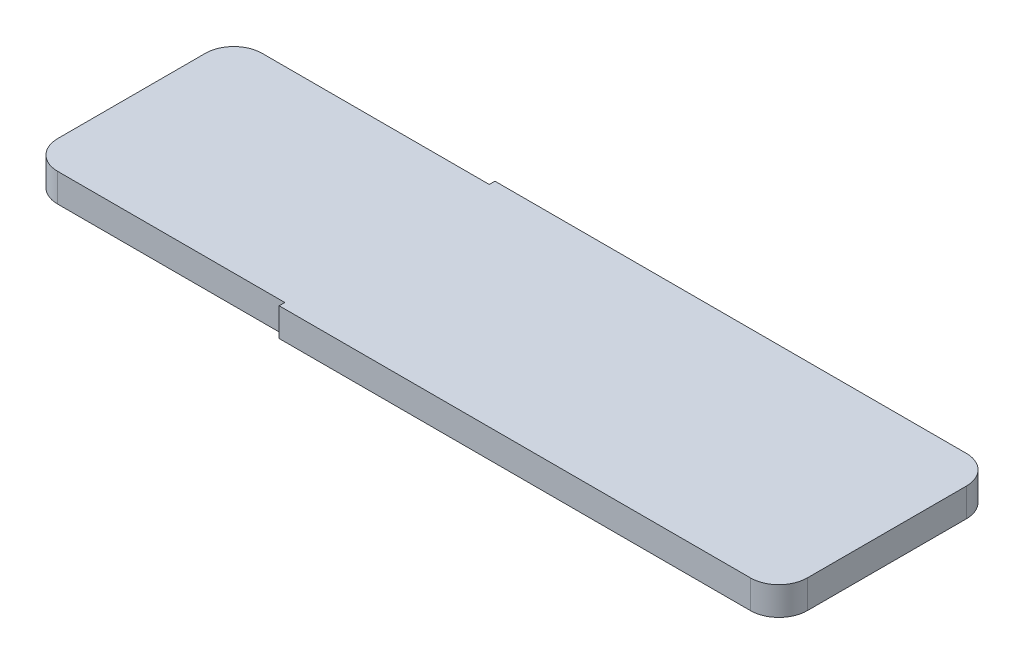
ISO-10303-21;
HEADER;
FILE_DESCRIPTION(('STEP AP214'),'2;1');
FILE_NAME('part.step','',(''),(''),'','','');
FILE_SCHEMA(('AUTOMOTIVE_DESIGN { 1 0 10303 214 1 1 1 1 }'));
ENDSEC;
DATA;
#1=APPLICATION_CONTEXT('core data for automotive mechanical design processes');
#2=APPLICATION_PROTOCOL_DEFINITION('international standard','automotive_design',2000,#1);
#3=PRODUCT_CONTEXT('',#1,'mechanical');
#4=PRODUCT('Part','Part','',(#3));
#5=PRODUCT_RELATED_PRODUCT_CATEGORY('part','',(#4));
#6=PRODUCT_DEFINITION_FORMATION('','',#4);
#7=PRODUCT_DEFINITION_CONTEXT('part definition',#1,'design');
#8=PRODUCT_DEFINITION('design','',#6,#7);
#9=PRODUCT_DEFINITION_SHAPE('','',#8);
#10=(LENGTH_UNIT() NAMED_UNIT(*) SI_UNIT(.MILLI.,.METRE.));
#11=(NAMED_UNIT(*) PLANE_ANGLE_UNIT() SI_UNIT($,.RADIAN.));
#12=(NAMED_UNIT(*) SI_UNIT($,.STERADIAN.) SOLID_ANGLE_UNIT());
#13=UNCERTAINTY_MEASURE_WITH_UNIT(LENGTH_MEASURE(1.E-05),#10,'distance_accuracy_value','');
#14=(GEOMETRIC_REPRESENTATION_CONTEXT(3) GLOBAL_UNCERTAINTY_ASSIGNED_CONTEXT((#13)) GLOBAL_UNIT_ASSIGNED_CONTEXT((#10,
#11,#12)) REPRESENTATION_CONTEXT('',''));
#15=CARTESIAN_POINT('',(0.,0.,0.));
#16=DIRECTION('',(0.,0.,1.));
#17=DIRECTION('',(1.,0.,0.));
#18=AXIS2_PLACEMENT_3D('',#15,#16,#17);
#19=CARTESIAN_POINT('',(-166.,5.,36.));
#20=DIRECTION('',(1.,0.,0.));
#21=DIRECTION('',(0.,0.,-1.));
#22=AXIS2_PLACEMENT_3D('',#19,#20,#21);
#23=PLANE('',#22);
#24=DIRECTION('',(0.,0.,1.));
#25=VECTOR('',#24,1.);
#26=CARTESIAN_POINT('',(-166.,-5.,36.));
#27=LINE('',#26,#25);
#28=CARTESIAN_POINT('',(-166.,-5.,-26.));
#29=VERTEX_POINT('',#28);
#30=CARTESIAN_POINT('',(-166.,-5.,26.));
#31=VERTEX_POINT('',#30);
#32=EDGE_CURVE('E169',#29,#31,#27,.T.);
#33=ORIENTED_EDGE('',*,*,#32,.T.);
#34=DIRECTION('',(0.,-1.,0.));
#35=VECTOR('',#34,1.);
#36=CARTESIAN_POINT('',(-166.,5.,26.));
#37=LINE('',#36,#35);
#38=CARTESIAN_POINT('',(-166.,5.,26.));
#39=VERTEX_POINT('',#38);
#40=EDGE_CURVE('E47',#31,#39,#37,.F.);
#41=ORIENTED_EDGE('',*,*,#40,.T.);
#42=DIRECTION('',(0.,0.,1.));
#43=VECTOR('',#42,1.);
#44=CARTESIAN_POINT('',(-166.,5.,36.));
#45=LINE('',#44,#43);
#46=CARTESIAN_POINT('',(-166.,5.,-26.));
#47=VERTEX_POINT('',#46);
#48=EDGE_CURVE('E140',#47,#39,#45,.T.);
#49=ORIENTED_EDGE('',*,*,#48,.F.);
#50=DIRECTION('',(0.,-1.,0.));
#51=VECTOR('',#50,1.);
#52=CARTESIAN_POINT('',(-166.,5.,-26.));
#53=LINE('',#52,#51);
#54=EDGE_CURVE('E218',#47,#29,#53,.T.);
#55=ORIENTED_EDGE('',*,*,#54,.T.);
#56=EDGE_LOOP('',(#33,#41,#49,#55));
#57=FACE_BOUND('',#56,.T.);
#58=ADVANCED_FACE('F39',(#57),#23,.F.);
#59=CARTESIAN_POINT('',(-76.,5.,36.));
#60=DIRECTION('',(0.,0.,-1.));
#61=DIRECTION('',(-1.,0.,0.));
#62=AXIS2_PLACEMENT_3D('',#59,#60,#61);
#63=PLANE('',#62);
#64=DIRECTION('',(1.,0.,0.));
#65=VECTOR('',#64,1.);
#66=CARTESIAN_POINT('',(-76.,5.,36.));
#67=LINE('',#66,#65);
#68=CARTESIAN_POINT('',(-156.,5.,36.));
#69=VERTEX_POINT('',#68);
#70=CARTESIAN_POINT('',(-76.,5.,36.));
#71=VERTEX_POINT('',#70);
#72=EDGE_CURVE('E127',#69,#71,#67,.T.);
#73=ORIENTED_EDGE('',*,*,#72,.F.);
#74=DIRECTION('',(0.,-1.,0.));
#75=VECTOR('',#74,1.);
#76=CARTESIAN_POINT('',(-156.,5.,36.));
#77=LINE('',#76,#75);
#78=CARTESIAN_POINT('',(-156.,-5.,36.));
#79=VERTEX_POINT('',#78);
#80=EDGE_CURVE('E216',#69,#79,#77,.T.);
#81=ORIENTED_EDGE('',*,*,#80,.T.);
#82=DIRECTION('',(1.,0.,0.));
#83=VECTOR('',#82,1.);
#84=CARTESIAN_POINT('',(-76.,-5.,36.));
#85=LINE('',#84,#83);
#86=CARTESIAN_POINT('',(-76.,-5.,36.));
#87=VERTEX_POINT('',#86);
#88=EDGE_CURVE('E146',#79,#87,#85,.T.);
#89=ORIENTED_EDGE('',*,*,#88,.T.);
#90=DIRECTION('',(0.,-1.,0.));
#91=VECTOR('',#90,1.);
#92=CARTESIAN_POINT('',(-76.,5.,36.));
#93=LINE('',#92,#91);
#94=EDGE_CURVE('E143',#71,#87,#93,.T.);
#95=ORIENTED_EDGE('',*,*,#94,.F.);
#96=EDGE_LOOP('',(#73,#81,#89,#95));
#97=FACE_BOUND('',#96,.T.);
#98=ADVANCED_FACE('F144',(#97),#63,.F.);
#99=CARTESIAN_POINT('',(-76.,5.,38.));
#100=DIRECTION('',(1.,0.,0.));
#101=DIRECTION('',(0.,0.,-1.));
#102=AXIS2_PLACEMENT_3D('',#99,#100,#101);
#103=PLANE('',#102);
#104=DIRECTION('',(0.,0.,1.));
#105=VECTOR('',#104,1.);
#106=CARTESIAN_POINT('',(-76.,-5.,38.));
#107=LINE('',#106,#105);
#108=CARTESIAN_POINT('',(-76.,-5.,38.));
#109=VERTEX_POINT('',#108);
#110=EDGE_CURVE('E173',#87,#109,#107,.T.);
#111=ORIENTED_EDGE('',*,*,#110,.T.);
#112=DIRECTION('',(0.,-1.,0.));
#113=VECTOR('',#112,1.);
#114=CARTESIAN_POINT('',(-76.,5.,38.));
#115=LINE('',#114,#113);
#116=CARTESIAN_POINT('',(-76.,5.,38.));
#117=VERTEX_POINT('',#116);
#118=EDGE_CURVE('E150',#117,#109,#115,.T.);
#119=ORIENTED_EDGE('',*,*,#118,.F.);
#120=DIRECTION('',(0.,0.,1.));
#121=VECTOR('',#120,1.);
#122=CARTESIAN_POINT('',(-76.,5.,38.));
#123=LINE('',#122,#121);
#124=EDGE_CURVE('E132',#71,#117,#123,.T.);
#125=ORIENTED_EDGE('',*,*,#124,.F.);
#126=ORIENTED_EDGE('',*,*,#94,.T.);
#127=EDGE_LOOP('',(#111,#119,#125,#126));
#128=FACE_BOUND('',#127,.T.);
#129=ADVANCED_FACE('F152',(#128),#103,.F.);
#130=CARTESIAN_POINT('',(100.,5.,38.));
#131=DIRECTION('',(0.,0.,-1.));
#132=DIRECTION('',(-1.,0.,0.));
#133=AXIS2_PLACEMENT_3D('',#130,#131,#132);
#134=PLANE('',#133);
#135=DIRECTION('',(1.,0.,0.));
#136=VECTOR('',#135,1.);
#137=CARTESIAN_POINT('',(100.,-5.,38.));
#138=LINE('',#137,#136);
#139=CARTESIAN_POINT('',(90.,-5.,38.));
#140=VERTEX_POINT('',#139);
#141=EDGE_CURVE('E175',#109,#140,#138,.T.);
#142=ORIENTED_EDGE('',*,*,#141,.T.);
#143=DIRECTION('',(0.,-1.,0.));
#144=VECTOR('',#143,1.);
#145=CARTESIAN_POINT('',(90.,5.,38.));
#146=LINE('',#145,#144);
#147=CARTESIAN_POINT('',(90.,5.,38.));
#148=VERTEX_POINT('',#147);
#149=EDGE_CURVE('E205',#140,#148,#146,.F.);
#150=ORIENTED_EDGE('',*,*,#149,.T.);
#151=DIRECTION('',(1.,0.,0.));
#152=VECTOR('',#151,1.);
#153=CARTESIAN_POINT('',(100.,5.,38.));
#154=LINE('',#153,#152);
#155=EDGE_CURVE('E155',#117,#148,#154,.T.);
#156=ORIENTED_EDGE('',*,*,#155,.F.);
#157=ORIENTED_EDGE('',*,*,#118,.T.);
#158=EDGE_LOOP('',(#142,#150,#156,#157));
#159=FACE_BOUND('',#158,.T.);
#160=ADVANCED_FACE('F233',(#159),#134,.F.);
#161=CARTESIAN_POINT('',(100.,5.,-38.));
#162=DIRECTION('',(-1.,0.,0.));
#163=DIRECTION('',(0.,0.,1.));
#164=AXIS2_PLACEMENT_3D('',#161,#162,#163);
#165=PLANE('',#164);
#166=DIRECTION('',(0.,0.,-1.));
#167=VECTOR('',#166,1.);
#168=CARTESIAN_POINT('',(100.,5.,-38.));
#169=LINE('',#168,#167);
#170=CARTESIAN_POINT('',(100.,5.,28.));
#171=VERTEX_POINT('',#170);
#172=CARTESIAN_POINT('',(100.,5.,-28.));
#173=VERTEX_POINT('',#172);
#174=EDGE_CURVE('E157',#171,#173,#169,.T.);
#175=ORIENTED_EDGE('',*,*,#174,.F.);
#176=DIRECTION('',(0.,-1.,0.));
#177=VECTOR('',#176,1.);
#178=CARTESIAN_POINT('',(100.,5.,28.));
#179=LINE('',#178,#177);
#180=CARTESIAN_POINT('',(100.,-5.,28.));
#181=VERTEX_POINT('',#180);
#182=EDGE_CURVE('E194',#171,#181,#179,.T.);
#183=ORIENTED_EDGE('',*,*,#182,.T.);
#184=DIRECTION('',(0.,0.,-1.));
#185=VECTOR('',#184,1.);
#186=CARTESIAN_POINT('',(100.,-5.,-38.));
#187=LINE('',#186,#185);
#188=CARTESIAN_POINT('',(100.,-5.,-28.));
#189=VERTEX_POINT('',#188);
#190=EDGE_CURVE('E178',#181,#189,#187,.T.);
#191=ORIENTED_EDGE('',*,*,#190,.T.);
#192=DIRECTION('',(0.,-1.,0.));
#193=VECTOR('',#192,1.);
#194=CARTESIAN_POINT('',(100.,5.,-28.));
#195=LINE('',#194,#193);
#196=EDGE_CURVE('E149',#189,#173,#195,.F.);
#197=ORIENTED_EDGE('',*,*,#196,.T.);
#198=EDGE_LOOP('',(#175,#183,#191,#197));
#199=FACE_BOUND('',#198,.T.);
#200=ADVANCED_FACE('F241',(#199),#165,.F.);
#201=CARTESIAN_POINT('',(-76.,5.,-38.));
#202=DIRECTION('',(0.,0.,1.));
#203=DIRECTION('',(1.,0.,0.));
#204=AXIS2_PLACEMENT_3D('',#201,#202,#203);
#205=PLANE('',#204);
#206=DIRECTION('',(-1.,0.,0.));
#207=VECTOR('',#206,1.);
#208=CARTESIAN_POINT('',(-76.,5.,-38.));
#209=LINE('',#208,#207);
#210=CARTESIAN_POINT('',(90.,5.,-38.));
#211=VERTEX_POINT('',#210);
#212=CARTESIAN_POINT('',(-76.,5.,-38.));
#213=VERTEX_POINT('',#212);
#214=EDGE_CURVE('E162',#211,#213,#209,.T.);
#215=ORIENTED_EDGE('',*,*,#214,.F.);
#216=DIRECTION('',(0.,-1.,0.));
#217=VECTOR('',#216,1.);
#218=CARTESIAN_POINT('',(90.,5.,-38.));
#219=LINE('',#218,#217);
#220=CARTESIAN_POINT('',(90.,-5.,-38.));
#221=VERTEX_POINT('',#220);
#222=EDGE_CURVE('E213',#211,#221,#219,.T.);
#223=ORIENTED_EDGE('',*,*,#222,.T.);
#224=DIRECTION('',(-1.,0.,0.));
#225=VECTOR('',#224,1.);
#226=CARTESIAN_POINT('',(-76.,-5.,-38.));
#227=LINE('',#226,#225);
#228=CARTESIAN_POINT('',(-76.,-5.,-38.));
#229=VERTEX_POINT('',#228);
#230=EDGE_CURVE('E181',#221,#229,#227,.T.);
#231=ORIENTED_EDGE('',*,*,#230,.T.);
#232=DIRECTION('',(0.,-1.,0.));
#233=VECTOR('',#232,1.);
#234=CARTESIAN_POINT('',(-76.,5.,-38.));
#235=LINE('',#234,#233);
#236=EDGE_CURVE('E189',#213,#229,#235,.T.);
#237=ORIENTED_EDGE('',*,*,#236,.F.);
#238=EDGE_LOOP('',(#215,#223,#231,#237));
#239=FACE_BOUND('',#238,.T.);
#240=ADVANCED_FACE('F249',(#239),#205,.F.);
#241=CARTESIAN_POINT('',(-76.,5.,-36.));
#242=DIRECTION('',(1.,0.,0.));
#243=DIRECTION('',(0.,0.,-1.));
#244=AXIS2_PLACEMENT_3D('',#241,#242,#243);
#245=PLANE('',#244);
#246=DIRECTION('',(0.,0.,1.));
#247=VECTOR('',#246,1.);
#248=CARTESIAN_POINT('',(-76.,-5.,-36.));
#249=LINE('',#248,#247);
#250=CARTESIAN_POINT('',(-76.,-5.,-36.));
#251=VERTEX_POINT('',#250);
#252=EDGE_CURVE('E183',#229,#251,#249,.T.);
#253=ORIENTED_EDGE('',*,*,#252,.T.);
#254=DIRECTION('',(0.,-1.,0.));
#255=VECTOR('',#254,1.);
#256=CARTESIAN_POINT('',(-76.,5.,-36.));
#257=LINE('',#256,#255);
#258=CARTESIAN_POINT('',(-76.,5.,-36.));
#259=VERTEX_POINT('',#258);
#260=EDGE_CURVE('E168',#259,#251,#257,.T.);
#261=ORIENTED_EDGE('',*,*,#260,.F.);
#262=DIRECTION('',(0.,0.,1.));
#263=VECTOR('',#262,1.);
#264=CARTESIAN_POINT('',(-76.,5.,-36.));
#265=LINE('',#264,#263);
#266=EDGE_CURVE('E164',#213,#259,#265,.T.);
#267=ORIENTED_EDGE('',*,*,#266,.F.);
#268=ORIENTED_EDGE('',*,*,#236,.T.);
#269=EDGE_LOOP('',(#253,#261,#267,#268));
#270=FACE_BOUND('',#269,.T.);
#271=ADVANCED_FACE('F254',(#270),#245,.F.);
#272=CARTESIAN_POINT('',(-166.,5.,-36.));
#273=DIRECTION('',(0.,0.,1.));
#274=DIRECTION('',(1.,0.,0.));
#275=AXIS2_PLACEMENT_3D('',#272,#273,#274);
#276=PLANE('',#275);
#277=DIRECTION('',(-1.,0.,0.));
#278=VECTOR('',#277,1.);
#279=CARTESIAN_POINT('',(-166.,-5.,-36.));
#280=LINE('',#279,#278);
#281=CARTESIAN_POINT('',(-156.,-5.,-36.));
#282=VERTEX_POINT('',#281);
#283=EDGE_CURVE('E185',#251,#282,#280,.T.);
#284=ORIENTED_EDGE('',*,*,#283,.T.);
#285=DIRECTION('',(0.,-1.,0.));
#286=VECTOR('',#285,1.);
#287=CARTESIAN_POINT('',(-156.,5.,-36.));
#288=LINE('',#287,#286);
#289=CARTESIAN_POINT('',(-156.,5.,-36.));
#290=VERTEX_POINT('',#289);
#291=EDGE_CURVE('E11',#282,#290,#288,.F.);
#292=ORIENTED_EDGE('',*,*,#291,.T.);
#293=DIRECTION('',(-1.,0.,0.));
#294=VECTOR('',#293,1.);
#295=CARTESIAN_POINT('',(-166.,5.,-36.));
#296=LINE('',#295,#294);
#297=EDGE_CURVE('E166',#259,#290,#296,.T.);
#298=ORIENTED_EDGE('',*,*,#297,.F.);
#299=ORIENTED_EDGE('',*,*,#260,.T.);
#300=EDGE_LOOP('',(#284,#292,#298,#299));
#301=FACE_BOUND('',#300,.T.);
#302=ADVANCED_FACE('F256',(#301),#276,.F.);
#303=CARTESIAN_POINT('',(0.,5.,0.));
#304=DIRECTION('',(0.,-1.,0.));
#305=DIRECTION('',(0.,0.,-1.));
#306=AXIS2_PLACEMENT_3D('',#303,#304,#305);
#307=PLANE('',#306);
#308=ORIENTED_EDGE('',*,*,#155,.T.);
#309=CARTESIAN_POINT('',(90.,5.,28.));
#310=DIRECTION('',(0.,-1.,0.));
#311=DIRECTION('',(0.,0.,-1.));
#312=AXIS2_PLACEMENT_3D('',#309,#310,#311);
#313=CIRCLE('',#312,10.);
#314=EDGE_CURVE('E211',#148,#171,#313,.F.);
#315=ORIENTED_EDGE('',*,*,#314,.T.);
#316=ORIENTED_EDGE('',*,*,#174,.T.);
#317=CARTESIAN_POINT('',(90.,5.,-28.));
#318=DIRECTION('',(0.,-1.,0.));
#319=DIRECTION('',(0.,0.,-1.));
#320=AXIS2_PLACEMENT_3D('',#317,#318,#319);
#321=CIRCLE('',#320,10.);
#322=EDGE_CURVE('E60',#173,#211,#321,.F.);
#323=ORIENTED_EDGE('',*,*,#322,.T.);
#324=ORIENTED_EDGE('',*,*,#214,.T.);
#325=ORIENTED_EDGE('',*,*,#266,.T.);
#326=ORIENTED_EDGE('',*,*,#297,.T.);
#327=CARTESIAN_POINT('',(-156.,5.,-26.));
#328=DIRECTION('',(0.,-1.,0.));
#329=DIRECTION('',(0.,0.,-1.));
#330=AXIS2_PLACEMENT_3D('',#327,#328,#329);
#331=CIRCLE('',#330,10.);
#332=EDGE_CURVE('E207',#290,#47,#331,.F.);
#333=ORIENTED_EDGE('',*,*,#332,.T.);
#334=ORIENTED_EDGE('',*,*,#48,.T.);
#335=CARTESIAN_POINT('',(-156.,5.,26.));
#336=DIRECTION('',(0.,-1.,0.));
#337=DIRECTION('',(0.,0.,-1.));
#338=AXIS2_PLACEMENT_3D('',#335,#336,#337);
#339=CIRCLE('',#338,10.);
#340=EDGE_CURVE('E136',#39,#69,#339,.F.);
#341=ORIENTED_EDGE('',*,*,#340,.T.);
#342=ORIENTED_EDGE('',*,*,#72,.T.);
#343=ORIENTED_EDGE('',*,*,#124,.T.);
#344=EDGE_LOOP('',(#308,#315,#316,#323,#324,#325,#326,#333,#334,#341,#342,#343));
#345=FACE_BOUND('',#344,.T.);
#346=ADVANCED_FACE('F130',(#345),#307,.F.);
#347=CARTESIAN_POINT('',(0.,-5.,0.));
#348=DIRECTION('',(0.,-1.,0.));
#349=DIRECTION('',(0.,0.,-1.));
#350=AXIS2_PLACEMENT_3D('',#347,#348,#349);
#351=PLANE('',#350);
#352=ORIENTED_EDGE('',*,*,#190,.F.);
#353=CARTESIAN_POINT('',(90.,-5.,28.));
#354=DIRECTION('',(0.,-1.,0.));
#355=DIRECTION('',(0.,0.,-1.));
#356=AXIS2_PLACEMENT_3D('',#353,#354,#355);
#357=CIRCLE('',#356,10.);
#358=EDGE_CURVE('E203',#181,#140,#357,.T.);
#359=ORIENTED_EDGE('',*,*,#358,.T.);
#360=ORIENTED_EDGE('',*,*,#141,.F.);
#361=ORIENTED_EDGE('',*,*,#110,.F.);
#362=ORIENTED_EDGE('',*,*,#88,.F.);
#363=CARTESIAN_POINT('',(-156.,-5.,26.));
#364=DIRECTION('',(0.,-1.,0.));
#365=DIRECTION('',(0.,0.,-1.));
#366=AXIS2_PLACEMENT_3D('',#363,#364,#365);
#367=CIRCLE('',#366,10.);
#368=EDGE_CURVE('E199',#79,#31,#367,.T.);
#369=ORIENTED_EDGE('',*,*,#368,.T.);
#370=ORIENTED_EDGE('',*,*,#32,.F.);
#371=CARTESIAN_POINT('',(-156.,-5.,-26.));
#372=DIRECTION('',(0.,-1.,0.));
#373=DIRECTION('',(0.,0.,-1.));
#374=AXIS2_PLACEMENT_3D('',#371,#372,#373);
#375=CIRCLE('',#374,10.);
#376=EDGE_CURVE('E197',#29,#282,#375,.T.);
#377=ORIENTED_EDGE('',*,*,#376,.T.);
#378=ORIENTED_EDGE('',*,*,#283,.F.);
#379=ORIENTED_EDGE('',*,*,#252,.F.);
#380=ORIENTED_EDGE('',*,*,#230,.F.);
#381=CARTESIAN_POINT('',(90.,-5.,-28.));
#382=DIRECTION('',(0.,-1.,0.));
#383=DIRECTION('',(0.,0.,-1.));
#384=AXIS2_PLACEMENT_3D('',#381,#382,#383);
#385=CIRCLE('',#384,10.);
#386=EDGE_CURVE('E201',#221,#189,#385,.T.);
#387=ORIENTED_EDGE('',*,*,#386,.T.);
#388=EDGE_LOOP('',(#352,#359,#360,#361,#362,#369,#370,#377,#378,#379,#380,#387));
#389=FACE_BOUND('',#388,.T.);
#390=ADVANCED_FACE('F230',(#389),#351,.T.);
#391=CARTESIAN_POINT('',(90.,5.,28.));
#392=DIRECTION('',(0.,-1.,0.));
#393=DIRECTION('',(0.,0.,-1.));
#394=AXIS2_PLACEMENT_3D('',#391,#392,#393);
#395=CYLINDRICAL_SURFACE('',#394,10.);
#396=ORIENTED_EDGE('',*,*,#314,.F.);
#397=ORIENTED_EDGE('',*,*,#149,.F.);
#398=ORIENTED_EDGE('',*,*,#358,.F.);
#399=ORIENTED_EDGE('',*,*,#182,.F.);
#400=EDGE_LOOP('',(#396,#397,#398,#399));
#401=FACE_BOUND('',#400,.T.);
#402=ADVANCED_FACE('F239',(#401),#395,.T.);
#403=CARTESIAN_POINT('',(90.,5.,-28.));
#404=DIRECTION('',(0.,-1.,0.));
#405=DIRECTION('',(0.,0.,-1.));
#406=AXIS2_PLACEMENT_3D('',#403,#404,#405);
#407=CYLINDRICAL_SURFACE('',#406,10.);
#408=ORIENTED_EDGE('',*,*,#322,.F.);
#409=ORIENTED_EDGE('',*,*,#196,.F.);
#410=ORIENTED_EDGE('',*,*,#386,.F.);
#411=ORIENTED_EDGE('',*,*,#222,.F.);
#412=EDGE_LOOP('',(#408,#409,#410,#411));
#413=FACE_BOUND('',#412,.T.);
#414=ADVANCED_FACE('F247',(#413),#407,.T.);
#415=CARTESIAN_POINT('',(-156.,5.,26.));
#416=DIRECTION('',(0.,-1.,0.));
#417=DIRECTION('',(0.,0.,-1.));
#418=AXIS2_PLACEMENT_3D('',#415,#416,#417);
#419=CYLINDRICAL_SURFACE('',#418,10.);
#420=ORIENTED_EDGE('',*,*,#340,.F.);
#421=ORIENTED_EDGE('',*,*,#40,.F.);
#422=ORIENTED_EDGE('',*,*,#368,.F.);
#423=ORIENTED_EDGE('',*,*,#80,.F.);
#424=EDGE_LOOP('',(#420,#421,#422,#423));
#425=FACE_BOUND('',#424,.T.);
#426=ADVANCED_FACE('F227',(#425),#419,.T.);
#427=CARTESIAN_POINT('',(-156.,5.,-26.));
#428=DIRECTION('',(0.,-1.,0.));
#429=DIRECTION('',(0.,0.,-1.));
#430=AXIS2_PLACEMENT_3D('',#427,#428,#429);
#431=CYLINDRICAL_SURFACE('',#430,10.);
#432=ORIENTED_EDGE('',*,*,#332,.F.);
#433=ORIENTED_EDGE('',*,*,#291,.F.);
#434=ORIENTED_EDGE('',*,*,#376,.F.);
#435=ORIENTED_EDGE('',*,*,#54,.F.);
#436=EDGE_LOOP('',(#432,#433,#434,#435));
#437=FACE_BOUND('',#436,.T.);
#438=ADVANCED_FACE('F41',(#437),#431,.T.);
#439=CLOSED_SHELL('',(#58,#98,#129,#160,#200,#240,#271,#302,#346,#390,#402,#414,#426,#438));
#440=MANIFOLD_SOLID_BREP('B2',#439);
#441=ADVANCED_BREP_SHAPE_REPRESENTATION('',(#18,#440),#14);
#442=SHAPE_DEFINITION_REPRESENTATION(#9,#441);
ENDSEC;
END-ISO-10303-21;
